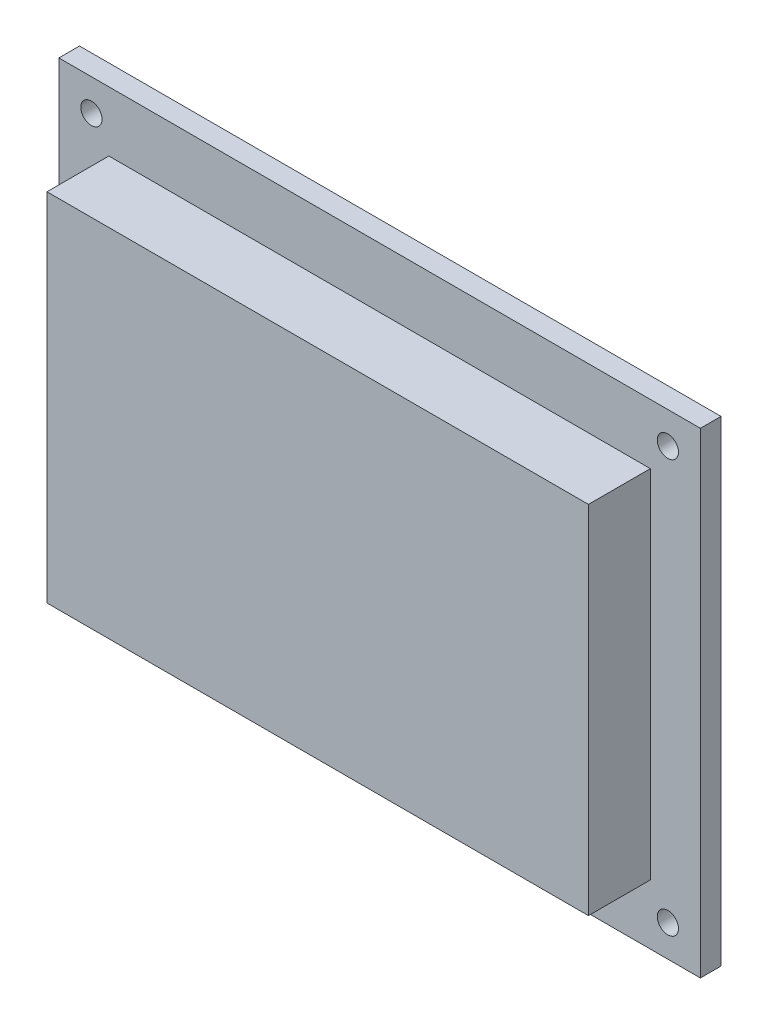
ISO-10303-21;
HEADER;
FILE_DESCRIPTION(('STEP AP214'),'2;1');
FILE_NAME('part.step','',(''),(''),'','','');
FILE_SCHEMA(('AUTOMOTIVE_DESIGN { 1 0 10303 214 1 1 1 1 }'));
ENDSEC;
DATA;
#1=APPLICATION_CONTEXT('core data for automotive mechanical design processes');
#2=APPLICATION_PROTOCOL_DEFINITION('international standard','automotive_design',2000,#1);
#3=PRODUCT_CONTEXT('',#1,'mechanical');
#4=PRODUCT('Part','Part','',(#3));
#5=PRODUCT_RELATED_PRODUCT_CATEGORY('part','',(#4));
#6=PRODUCT_DEFINITION_FORMATION('','',#4);
#7=PRODUCT_DEFINITION_CONTEXT('part definition',#1,'design');
#8=PRODUCT_DEFINITION('design','',#6,#7);
#9=PRODUCT_DEFINITION_SHAPE('','',#8);
#10=(LENGTH_UNIT() NAMED_UNIT(*) SI_UNIT(.MILLI.,.METRE.));
#11=(NAMED_UNIT(*) PLANE_ANGLE_UNIT() SI_UNIT($,.RADIAN.));
#12=(NAMED_UNIT(*) SI_UNIT($,.STERADIAN.) SOLID_ANGLE_UNIT());
#13=UNCERTAINTY_MEASURE_WITH_UNIT(LENGTH_MEASURE(1.E-05),#10,'distance_accuracy_value','');
#14=(GEOMETRIC_REPRESENTATION_CONTEXT(3) GLOBAL_UNCERTAINTY_ASSIGNED_CONTEXT((#13)) GLOBAL_UNIT_ASSIGNED_CONTEXT((#10,
#11,#12)) REPRESENTATION_CONTEXT('',''));
#15=CARTESIAN_POINT('',(0.,0.,0.));
#16=DIRECTION('',(0.,0.,1.));
#17=DIRECTION('',(1.,0.,0.));
#18=AXIS2_PLACEMENT_3D('',#15,#16,#17);
#19=CARTESIAN_POINT('',(0.,0.,3.175));
#20=DIRECTION('',(0.,0.,-1.));
#21=DIRECTION('',(-1.,0.,0.));
#22=AXIS2_PLACEMENT_3D('',#19,#20,#21);
#23=PLANE('',#22);
#24=CARTESIAN_POINT('',(-44.3357,31.7373,3.175));
#25=DIRECTION('',(0.,0.,-1.));
#26=DIRECTION('',(-1.,0.,0.));
#27=AXIS2_PLACEMENT_3D('',#24,#25,#26);
#28=CIRCLE('',#27,1.63194999999999);
#29=CARTESIAN_POINT('',(-45.96765,31.7373,3.175));
#30=VERTEX_POINT('',#29);
#31=EDGE_CURVE('E307',#30,#30,#28,.T.);
#32=ORIENTED_EDGE('',*,*,#31,.T.);
#33=EDGE_LOOP('',(#32));
#34=FACE_BOUND('',#33,.T.);
#35=CARTESIAN_POINT('',(44.3357,31.7373,3.175));
#36=DIRECTION('',(0.,0.,-1.));
#37=DIRECTION('',(-1.,0.,0.));
#38=AXIS2_PLACEMENT_3D('',#35,#36,#37);
#39=CIRCLE('',#38,1.63194999999999);
#40=CARTESIAN_POINT('',(42.70375,31.7373,3.175));
#41=VERTEX_POINT('',#40);
#42=EDGE_CURVE('E311',#41,#41,#39,.T.);
#43=ORIENTED_EDGE('',*,*,#42,.T.);
#44=EDGE_LOOP('',(#43));
#45=FACE_BOUND('',#44,.T.);
#46=CARTESIAN_POINT('',(44.3357,-31.7373,3.175));
#47=DIRECTION('',(0.,0.,-1.));
#48=DIRECTION('',(-1.,0.,0.));
#49=AXIS2_PLACEMENT_3D('',#46,#47,#48);
#50=CIRCLE('',#49,1.63194999999999);
#51=CARTESIAN_POINT('',(42.70375,-31.7373,3.175));
#52=VERTEX_POINT('',#51);
#53=EDGE_CURVE('E320',#52,#52,#50,.T.);
#54=ORIENTED_EDGE('',*,*,#53,.T.);
#55=EDGE_LOOP('',(#54));
#56=FACE_BOUND('',#55,.T.);
#57=CARTESIAN_POINT('',(-44.3357,-31.7373,3.175));
#58=DIRECTION('',(0.,0.,-1.));
#59=DIRECTION('',(-1.,0.,0.));
#60=AXIS2_PLACEMENT_3D('',#57,#58,#59);
#61=CIRCLE('',#60,1.63194999999999);
#62=CARTESIAN_POINT('',(-45.96765,-31.7373,3.175));
#63=VERTEX_POINT('',#62);
#64=EDGE_CURVE('E326',#63,#63,#61,.T.);
#65=ORIENTED_EDGE('',*,*,#64,.T.);
#66=EDGE_LOOP('',(#65));
#67=FACE_BOUND('',#66,.T.);
#68=DIRECTION('',(0.,1.,0.));
#69=VECTOR('',#68,1.);
#70=CARTESIAN_POINT('',(49.3395,-36.6141,3.175));
#71=LINE('',#70,#69);
#72=CARTESIAN_POINT('',(49.3395,-36.6141,3.175));
#73=VERTEX_POINT('',#72);
#74=CARTESIAN_POINT('',(49.3395,36.6141,3.175));
#75=VERTEX_POINT('',#74);
#76=EDGE_CURVE('E128',#73,#75,#71,.T.);
#77=ORIENTED_EDGE('',*,*,#76,.T.);
#78=DIRECTION('',(-1.,0.,0.));
#79=VECTOR('',#78,1.);
#80=CARTESIAN_POINT('',(-49.3395,36.6141,3.175));
#81=LINE('',#80,#79);
#82=CARTESIAN_POINT('',(-49.3395,36.6141,3.175));
#83=VERTEX_POINT('',#82);
#84=EDGE_CURVE('E131',#75,#83,#81,.T.);
#85=ORIENTED_EDGE('',*,*,#84,.T.);
#86=DIRECTION('',(0.,-1.,0.));
#87=VECTOR('',#86,1.);
#88=CARTESIAN_POINT('',(-49.3395,-36.6141,3.175));
#89=LINE('',#88,#87);
#90=CARTESIAN_POINT('',(-49.3395,-36.6141,3.175));
#91=VERTEX_POINT('',#90);
#92=EDGE_CURVE('E134',#83,#91,#89,.T.);
#93=ORIENTED_EDGE('',*,*,#92,.T.);
#94=DIRECTION('',(1.,0.,0.));
#95=VECTOR('',#94,1.);
#96=CARTESIAN_POINT('',(-49.3395,-36.6141,3.175));
#97=LINE('',#96,#95);
#98=EDGE_CURVE('E136',#91,#73,#97,.T.);
#99=ORIENTED_EDGE('',*,*,#98,.T.);
#100=EDGE_LOOP('',(#77,#85,#93,#99));
#101=FACE_BOUND('',#100,.T.);
#102=DIRECTION('',(0.,1.,0.));
#103=VECTOR('',#102,1.);
#104=CARTESIAN_POINT('',(41.6433,-27.3939,3.175));
#105=LINE('',#104,#103);
#106=CARTESIAN_POINT('',(41.6433,-27.3939,3.175));
#107=VERTEX_POINT('',#106);
#108=CARTESIAN_POINT('',(41.6433,27.3939,3.175));
#109=VERTEX_POINT('',#108);
#110=EDGE_CURVE('E118',#107,#109,#105,.T.);
#111=ORIENTED_EDGE('',*,*,#110,.F.);
#112=DIRECTION('',(1.,0.,0.));
#113=VECTOR('',#112,1.);
#114=CARTESIAN_POINT('',(-41.6433,-27.3939,3.175));
#115=LINE('',#114,#113);
#116=CARTESIAN_POINT('',(-41.6433,-27.3939,3.175));
#117=VERTEX_POINT('',#116);
#118=EDGE_CURVE('E115',#117,#107,#115,.T.);
#119=ORIENTED_EDGE('',*,*,#118,.F.);
#120=DIRECTION('',(0.,-1.,0.));
#121=VECTOR('',#120,1.);
#122=CARTESIAN_POINT('',(-41.6433,-27.3939,3.175));
#123=LINE('',#122,#121);
#124=CARTESIAN_POINT('',(-41.6433,27.3939,3.175));
#125=VERTEX_POINT('',#124);
#126=EDGE_CURVE('E53',#125,#117,#123,.T.);
#127=ORIENTED_EDGE('',*,*,#126,.F.);
#128=DIRECTION('',(-1.,0.,0.));
#129=VECTOR('',#128,1.);
#130=CARTESIAN_POINT('',(-41.6433,27.3939,3.175));
#131=LINE('',#130,#129);
#132=EDGE_CURVE('E48',#109,#125,#131,.T.);
#133=ORIENTED_EDGE('',*,*,#132,.F.);
#134=EDGE_LOOP('',(#111,#119,#127,#133));
#135=FACE_BOUND('',#134,.T.);
#136=ADVANCED_FACE('F33',(#34,#45,#56,#67,#101,#135),#23,.F.);
#137=CARTESIAN_POINT('',(49.3395,-36.6141,3.175));
#138=DIRECTION('',(-1.,0.,0.));
#139=DIRECTION('',(0.,0.,1.));
#140=AXIS2_PLACEMENT_3D('',#137,#138,#139);
#141=PLANE('',#140);
#142=DIRECTION('',(0.,1.,0.));
#143=VECTOR('',#142,1.);
#144=CARTESIAN_POINT('',(49.3395,-36.6141,0.));
#145=LINE('',#144,#143);
#146=CARTESIAN_POINT('',(49.3395,-36.6141,0.));
#147=VERTEX_POINT('',#146);
#148=CARTESIAN_POINT('',(49.3395,36.6141,0.));
#149=VERTEX_POINT('',#148);
#150=EDGE_CURVE('E119',#147,#149,#145,.T.);
#151=ORIENTED_EDGE('',*,*,#150,.T.);
#152=DIRECTION('',(0.,0.,-1.));
#153=VECTOR('',#152,1.);
#154=CARTESIAN_POINT('',(49.3395,36.6141,3.175));
#155=LINE('',#154,#153);
#156=EDGE_CURVE('E11',#75,#149,#155,.T.);
#157=ORIENTED_EDGE('',*,*,#156,.F.);
#158=ORIENTED_EDGE('',*,*,#76,.F.);
#159=DIRECTION('',(0.,0.,-1.));
#160=VECTOR('',#159,1.);
#161=CARTESIAN_POINT('',(49.3395,-36.6141,3.175));
#162=LINE('',#161,#160);
#163=EDGE_CURVE('E137',#73,#147,#162,.T.);
#164=ORIENTED_EDGE('',*,*,#163,.T.);
#165=EDGE_LOOP('',(#151,#157,#158,#164));
#166=FACE_BOUND('',#165,.T.);
#167=ADVANCED_FACE('F35',(#166),#141,.F.);
#168=CARTESIAN_POINT('',(-49.3395,36.6141,3.175));
#169=DIRECTION('',(0.,-1.,0.));
#170=DIRECTION('',(0.,0.,-1.));
#171=AXIS2_PLACEMENT_3D('',#168,#169,#170);
#172=PLANE('',#171);
#173=DIRECTION('',(-1.,0.,0.));
#174=VECTOR('',#173,1.);
#175=CARTESIAN_POINT('',(-49.3395,36.6141,0.));
#176=LINE('',#175,#174);
#177=CARTESIAN_POINT('',(-49.3395,36.6141,0.));
#178=VERTEX_POINT('',#177);
#179=EDGE_CURVE('E122',#149,#178,#176,.T.);
#180=ORIENTED_EDGE('',*,*,#179,.T.);
#181=DIRECTION('',(0.,0.,-1.));
#182=VECTOR('',#181,1.);
#183=CARTESIAN_POINT('',(-49.3395,36.6141,3.175));
#184=LINE('',#183,#182);
#185=EDGE_CURVE('E41',#83,#178,#184,.T.);
#186=ORIENTED_EDGE('',*,*,#185,.F.);
#187=ORIENTED_EDGE('',*,*,#84,.F.);
#188=ORIENTED_EDGE('',*,*,#156,.T.);
#189=EDGE_LOOP('',(#180,#186,#187,#188));
#190=FACE_BOUND('',#189,.T.);
#191=ADVANCED_FACE('F167',(#190),#172,.F.);
#192=CARTESIAN_POINT('',(-49.3395,-36.6141,3.175));
#193=DIRECTION('',(1.,0.,0.));
#194=DIRECTION('',(0.,0.,-1.));
#195=AXIS2_PLACEMENT_3D('',#192,#193,#194);
#196=PLANE('',#195);
#197=DIRECTION('',(0.,-1.,0.));
#198=VECTOR('',#197,1.);
#199=CARTESIAN_POINT('',(-49.3395,-36.6141,0.));
#200=LINE('',#199,#198);
#201=CARTESIAN_POINT('',(-49.3395,-36.6141,0.));
#202=VERTEX_POINT('',#201);
#203=EDGE_CURVE('E140',#178,#202,#200,.T.);
#204=ORIENTED_EDGE('',*,*,#203,.T.);
#205=DIRECTION('',(0.,0.,-1.));
#206=VECTOR('',#205,1.);
#207=CARTESIAN_POINT('',(-49.3395,-36.6141,3.175));
#208=LINE('',#207,#206);
#209=EDGE_CURVE('E145',#91,#202,#208,.T.);
#210=ORIENTED_EDGE('',*,*,#209,.F.);
#211=ORIENTED_EDGE('',*,*,#92,.F.);
#212=ORIENTED_EDGE('',*,*,#185,.T.);
#213=EDGE_LOOP('',(#204,#210,#211,#212));
#214=FACE_BOUND('',#213,.T.);
#215=ADVANCED_FACE('F152',(#214),#196,.F.);
#216=CARTESIAN_POINT('',(-49.3395,-36.6141,3.175));
#217=DIRECTION('',(0.,1.,0.));
#218=DIRECTION('',(0.,0.,1.));
#219=AXIS2_PLACEMENT_3D('',#216,#217,#218);
#220=PLANE('',#219);
#221=DIRECTION('',(1.,0.,0.));
#222=VECTOR('',#221,1.);
#223=CARTESIAN_POINT('',(-49.3395,-36.6141,0.));
#224=LINE('',#223,#222);
#225=EDGE_CURVE('E132',#202,#147,#224,.T.);
#226=ORIENTED_EDGE('',*,*,#225,.T.);
#227=ORIENTED_EDGE('',*,*,#163,.F.);
#228=ORIENTED_EDGE('',*,*,#98,.F.);
#229=ORIENTED_EDGE('',*,*,#209,.T.);
#230=EDGE_LOOP('',(#226,#227,#228,#229));
#231=FACE_BOUND('',#230,.T.);
#232=ADVANCED_FACE('F161',(#231),#220,.F.);
#233=CARTESIAN_POINT('',(0.,0.,0.));
#234=DIRECTION('',(0.,0.,-1.));
#235=DIRECTION('',(-1.,0.,0.));
#236=AXIS2_PLACEMENT_3D('',#233,#234,#235);
#237=PLANE('',#236);
#238=CARTESIAN_POINT('',(-44.3357,31.7373,0.));
#239=DIRECTION('',(0.,0.,-1.));
#240=DIRECTION('',(-1.,0.,0.));
#241=AXIS2_PLACEMENT_3D('',#238,#239,#240);
#242=CIRCLE('',#241,1.63194999999999);
#243=CARTESIAN_POINT('',(-45.96765,31.7373,0.));
#244=VERTEX_POINT('',#243);
#245=EDGE_CURVE('E305',#244,#244,#242,.T.);
#246=ORIENTED_EDGE('',*,*,#245,.F.);
#247=EDGE_LOOP('',(#246));
#248=FACE_BOUND('',#247,.T.);
#249=CARTESIAN_POINT('',(44.3357,31.7373,0.));
#250=DIRECTION('',(0.,0.,-1.));
#251=DIRECTION('',(-1.,0.,0.));
#252=AXIS2_PLACEMENT_3D('',#249,#250,#251);
#253=CIRCLE('',#252,1.63194999999999);
#254=CARTESIAN_POINT('',(42.70375,31.7373,0.));
#255=VERTEX_POINT('',#254);
#256=EDGE_CURVE('E308',#255,#255,#253,.T.);
#257=ORIENTED_EDGE('',*,*,#256,.F.);
#258=EDGE_LOOP('',(#257));
#259=FACE_BOUND('',#258,.T.);
#260=CARTESIAN_POINT('',(44.3357,-31.7373,0.));
#261=DIRECTION('',(0.,0.,-1.));
#262=DIRECTION('',(-1.,0.,0.));
#263=AXIS2_PLACEMENT_3D('',#260,#261,#262);
#264=CIRCLE('',#263,1.63194999999999);
#265=CARTESIAN_POINT('',(42.70375,-31.7373,0.));
#266=VERTEX_POINT('',#265);
#267=EDGE_CURVE('E317',#266,#266,#264,.T.);
#268=ORIENTED_EDGE('',*,*,#267,.F.);
#269=EDGE_LOOP('',(#268));
#270=FACE_BOUND('',#269,.T.);
#271=CARTESIAN_POINT('',(-44.3357,-31.7373,0.));
#272=DIRECTION('',(0.,0.,-1.));
#273=DIRECTION('',(-1.,0.,0.));
#274=AXIS2_PLACEMENT_3D('',#271,#272,#273);
#275=CIRCLE('',#274,1.63194999999999);
#276=CARTESIAN_POINT('',(-45.96765,-31.7373,0.));
#277=VERTEX_POINT('',#276);
#278=EDGE_CURVE('E323',#277,#277,#275,.T.);
#279=ORIENTED_EDGE('',*,*,#278,.F.);
#280=EDGE_LOOP('',(#279));
#281=FACE_BOUND('',#280,.T.);
#282=ORIENTED_EDGE('',*,*,#150,.F.);
#283=ORIENTED_EDGE('',*,*,#225,.F.);
#284=ORIENTED_EDGE('',*,*,#203,.F.);
#285=ORIENTED_EDGE('',*,*,#179,.F.);
#286=EDGE_LOOP('',(#282,#283,#284,#285));
#287=FACE_BOUND('',#286,.T.);
#288=ADVANCED_FACE('F158',(#248,#259,#270,#281,#287),#237,.T.);
#289=CARTESIAN_POINT('',(41.6433,-27.3939,12.7));
#290=DIRECTION('',(-1.,0.,0.));
#291=DIRECTION('',(0.,0.,1.));
#292=AXIS2_PLACEMENT_3D('',#289,#290,#291);
#293=PLANE('',#292);
#294=ORIENTED_EDGE('',*,*,#110,.T.);
#295=DIRECTION('',(0.,0.,-1.));
#296=VECTOR('',#295,1.);
#297=CARTESIAN_POINT('',(41.6433,27.3939,12.7));
#298=LINE('',#297,#296);
#299=CARTESIAN_POINT('',(41.6433,27.3939,12.7));
#300=VERTEX_POINT('',#299);
#301=EDGE_CURVE('E99',#300,#109,#298,.T.);
#302=ORIENTED_EDGE('',*,*,#301,.F.);
#303=DIRECTION('',(0.,1.,0.));
#304=VECTOR('',#303,1.);
#305=CARTESIAN_POINT('',(41.6433,-27.3939,12.7));
#306=LINE('',#305,#304);
#307=CARTESIAN_POINT('',(41.6433,-27.3939,12.7));
#308=VERTEX_POINT('',#307);
#309=EDGE_CURVE('E106',#308,#300,#306,.T.);
#310=ORIENTED_EDGE('',*,*,#309,.F.);
#311=DIRECTION('',(0.,0.,-1.));
#312=VECTOR('',#311,1.);
#313=CARTESIAN_POINT('',(41.6433,-27.3939,12.7));
#314=LINE('',#313,#312);
#315=EDGE_CURVE('E331',#308,#107,#314,.T.);
#316=ORIENTED_EDGE('',*,*,#315,.T.);
#317=EDGE_LOOP('',(#294,#302,#310,#316));
#318=FACE_BOUND('',#317,.T.);
#319=ADVANCED_FACE('F117',(#318),#293,.F.);
#320=CARTESIAN_POINT('',(-41.6433,27.3939,12.7));
#321=DIRECTION('',(0.,-1.,0.));
#322=DIRECTION('',(0.,0.,-1.));
#323=AXIS2_PLACEMENT_3D('',#320,#321,#322);
#324=PLANE('',#323);
#325=ORIENTED_EDGE('',*,*,#132,.T.);
#326=DIRECTION('',(0.,0.,-1.));
#327=VECTOR('',#326,1.);
#328=CARTESIAN_POINT('',(-41.6433,27.3939,12.7));
#329=LINE('',#328,#327);
#330=CARTESIAN_POINT('',(-41.6433,27.3939,12.7));
#331=VERTEX_POINT('',#330);
#332=EDGE_CURVE('E102',#331,#125,#329,.T.);
#333=ORIENTED_EDGE('',*,*,#332,.F.);
#334=DIRECTION('',(-1.,0.,0.));
#335=VECTOR('',#334,1.);
#336=CARTESIAN_POINT('',(-41.6433,27.3939,12.7));
#337=LINE('',#336,#335);
#338=EDGE_CURVE('E95',#300,#331,#337,.T.);
#339=ORIENTED_EDGE('',*,*,#338,.F.);
#340=ORIENTED_EDGE('',*,*,#301,.T.);
#341=EDGE_LOOP('',(#325,#333,#339,#340));
#342=FACE_BOUND('',#341,.T.);
#343=ADVANCED_FACE('F97',(#342),#324,.F.);
#344=CARTESIAN_POINT('',(-41.6433,-27.3939,12.7));
#345=DIRECTION('',(1.,0.,0.));
#346=DIRECTION('',(0.,0.,-1.));
#347=AXIS2_PLACEMENT_3D('',#344,#345,#346);
#348=PLANE('',#347);
#349=ORIENTED_EDGE('',*,*,#126,.T.);
#350=DIRECTION('',(0.,0.,-1.));
#351=VECTOR('',#350,1.);
#352=CARTESIAN_POINT('',(-41.6433,-27.3939,12.7));
#353=LINE('',#352,#351);
#354=CARTESIAN_POINT('',(-41.6433,-27.3939,12.7));
#355=VERTEX_POINT('',#354);
#356=EDGE_CURVE('E124',#355,#117,#353,.T.);
#357=ORIENTED_EDGE('',*,*,#356,.F.);
#358=DIRECTION('',(0.,-1.,0.));
#359=VECTOR('',#358,1.);
#360=CARTESIAN_POINT('',(-41.6433,-27.3939,12.7));
#361=LINE('',#360,#359);
#362=EDGE_CURVE('E105',#331,#355,#361,.T.);
#363=ORIENTED_EDGE('',*,*,#362,.F.);
#364=ORIENTED_EDGE('',*,*,#332,.T.);
#365=EDGE_LOOP('',(#349,#357,#363,#364));
#366=FACE_BOUND('',#365,.T.);
#367=ADVANCED_FACE('F208',(#366),#348,.F.);
#368=CARTESIAN_POINT('',(-41.6433,-27.3939,12.7));
#369=DIRECTION('',(0.,1.,0.));
#370=DIRECTION('',(0.,0.,1.));
#371=AXIS2_PLACEMENT_3D('',#368,#369,#370);
#372=PLANE('',#371);
#373=ORIENTED_EDGE('',*,*,#118,.T.);
#374=ORIENTED_EDGE('',*,*,#315,.F.);
#375=DIRECTION('',(1.,0.,0.));
#376=VECTOR('',#375,1.);
#377=CARTESIAN_POINT('',(-41.6433,-27.3939,12.7));
#378=LINE('',#377,#376);
#379=EDGE_CURVE('E111',#355,#308,#378,.T.);
#380=ORIENTED_EDGE('',*,*,#379,.F.);
#381=ORIENTED_EDGE('',*,*,#356,.T.);
#382=EDGE_LOOP('',(#373,#374,#380,#381));
#383=FACE_BOUND('',#382,.T.);
#384=ADVANCED_FACE('F214',(#383),#372,.F.);
#385=CARTESIAN_POINT('',(0.,0.,12.7));
#386=DIRECTION('',(0.,0.,-1.));
#387=DIRECTION('',(-1.,0.,0.));
#388=AXIS2_PLACEMENT_3D('',#385,#386,#387);
#389=PLANE('',#388);
#390=ORIENTED_EDGE('',*,*,#309,.T.);
#391=ORIENTED_EDGE('',*,*,#338,.T.);
#392=ORIENTED_EDGE('',*,*,#362,.T.);
#393=ORIENTED_EDGE('',*,*,#379,.T.);
#394=EDGE_LOOP('',(#390,#391,#392,#393));
#395=FACE_BOUND('',#394,.T.);
#396=ADVANCED_FACE('F109',(#395),#389,.F.);
#397=CARTESIAN_POINT('',(-44.3357,-31.7373,12.7));
#398=DIRECTION('',(0.,0.,1.));
#399=DIRECTION('',(1.,0.,0.));
#400=AXIS2_PLACEMENT_3D('',#397,#398,#399);
#401=CYLINDRICAL_SURFACE('',#400,1.63194999999999);
#402=ORIENTED_EDGE('',*,*,#278,.T.);
#403=EDGE_LOOP('',(#402));
#404=FACE_BOUND('',#403,.T.);
#405=ORIENTED_EDGE('',*,*,#64,.F.);
#406=EDGE_LOOP('',(#405));
#407=FACE_BOUND('',#406,.T.);
#408=ADVANCED_FACE('F229',(#404,#407),#401,.F.);
#409=CARTESIAN_POINT('',(44.3357,-31.7373,12.7));
#410=DIRECTION('',(0.,0.,1.));
#411=DIRECTION('',(1.,0.,0.));
#412=AXIS2_PLACEMENT_3D('',#409,#410,#411);
#413=CYLINDRICAL_SURFACE('',#412,1.63194999999999);
#414=ORIENTED_EDGE('',*,*,#267,.T.);
#415=EDGE_LOOP('',(#414));
#416=FACE_BOUND('',#415,.T.);
#417=ORIENTED_EDGE('',*,*,#53,.F.);
#418=EDGE_LOOP('',(#417));
#419=FACE_BOUND('',#418,.T.);
#420=ADVANCED_FACE('F235',(#416,#419),#413,.F.);
#421=CARTESIAN_POINT('',(44.3357,31.7373,12.7));
#422=DIRECTION('',(0.,0.,1.));
#423=DIRECTION('',(1.,0.,0.));
#424=AXIS2_PLACEMENT_3D('',#421,#422,#423);
#425=CYLINDRICAL_SURFACE('',#424,1.63194999999999);
#426=ORIENTED_EDGE('',*,*,#256,.T.);
#427=EDGE_LOOP('',(#426));
#428=FACE_BOUND('',#427,.T.);
#429=ORIENTED_EDGE('',*,*,#42,.F.);
#430=EDGE_LOOP('',(#429));
#431=FACE_BOUND('',#430,.T.);
#432=ADVANCED_FACE('F243',(#428,#431),#425,.F.);
#433=CARTESIAN_POINT('',(-44.3357,31.7373,12.7));
#434=DIRECTION('',(0.,0.,1.));
#435=DIRECTION('',(1.,0.,0.));
#436=AXIS2_PLACEMENT_3D('',#433,#434,#435);
#437=CYLINDRICAL_SURFACE('',#436,1.63194999999999);
#438=ORIENTED_EDGE('',*,*,#245,.T.);
#439=EDGE_LOOP('',(#438));
#440=FACE_BOUND('',#439,.T.);
#441=ORIENTED_EDGE('',*,*,#31,.F.);
#442=EDGE_LOOP('',(#441));
#443=FACE_BOUND('',#442,.T.);
#444=ADVANCED_FACE('F251',(#440,#443),#437,.F.);
#445=CLOSED_SHELL('',(#136,#167,#191,#215,#232,#288,#319,#343,#367,#384,#396,#408,#420,#432,#444));
#446=MANIFOLD_SOLID_BREP('B2',#445);
#447=ADVANCED_BREP_SHAPE_REPRESENTATION('',(#18,#446),#14);
#448=SHAPE_DEFINITION_REPRESENTATION(#9,#447);
ENDSEC;
END-ISO-10303-21;
